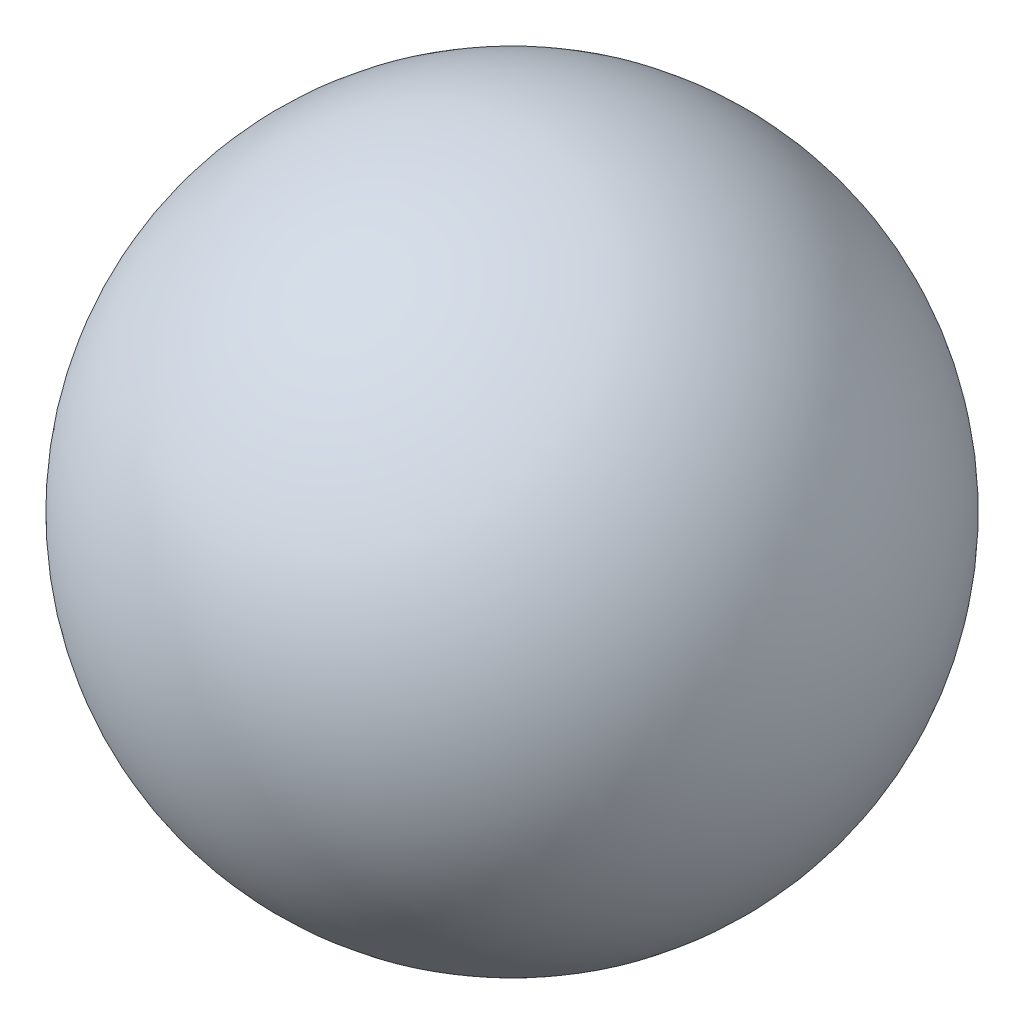
ISO-10303-21;
HEADER;
FILE_DESCRIPTION(('STEP AP214'),'2;1');
FILE_NAME('part.step','',(''),(''),'','','');
FILE_SCHEMA(('AUTOMOTIVE_DESIGN { 1 0 10303 214 1 1 1 1 }'));
ENDSEC;
DATA;
#1=APPLICATION_CONTEXT('core data for automotive mechanical design processes');
#2=APPLICATION_PROTOCOL_DEFINITION('international standard','automotive_design',2000,#1);
#3=PRODUCT_CONTEXT('',#1,'mechanical');
#4=PRODUCT('Part','Part','',(#3));
#5=PRODUCT_RELATED_PRODUCT_CATEGORY('part','',(#4));
#6=PRODUCT_DEFINITION_FORMATION('','',#4);
#7=PRODUCT_DEFINITION_CONTEXT('part definition',#1,'design');
#8=PRODUCT_DEFINITION('design','',#6,#7);
#9=PRODUCT_DEFINITION_SHAPE('','',#8);
#10=(LENGTH_UNIT() NAMED_UNIT(*) SI_UNIT(.MILLI.,.METRE.));
#11=(NAMED_UNIT(*) PLANE_ANGLE_UNIT() SI_UNIT($,.RADIAN.));
#12=(NAMED_UNIT(*) SI_UNIT($,.STERADIAN.) SOLID_ANGLE_UNIT());
#13=UNCERTAINTY_MEASURE_WITH_UNIT(LENGTH_MEASURE(1.E-05),#10,'distance_accuracy_value','');
#14=(GEOMETRIC_REPRESENTATION_CONTEXT(3) GLOBAL_UNCERTAINTY_ASSIGNED_CONTEXT((#13)) GLOBAL_UNIT_ASSIGNED_CONTEXT((#10,
#11,#12)) REPRESENTATION_CONTEXT('',''));
#15=CARTESIAN_POINT('',(0.,0.,0.));
#16=DIRECTION('',(0.,0.,1.));
#17=DIRECTION('',(1.,0.,0.));
#18=AXIS2_PLACEMENT_3D('',#15,#16,#17);
#19=CARTESIAN_POINT('',(0.,0.,0.));
#20=DIRECTION('',(0.,1.,0.));
#21=DIRECTION('',(1.,0.,0.));
#22=AXIS2_PLACEMENT_3D('',#19,#20,#21);
#23=SPHERICAL_SURFACE('',#22,20.);
#24=CARTESIAN_POINT('',(0.,20.,0.));
#25=VERTEX_POINT('',#24);
#26=VERTEX_LOOP('',#25);
#27=FACE_BOUND('',#26,.T.);
#28=ADVANCED_FACE('F46',(#27),#23,.T.);
#29=CLOSED_SHELL('',(#28));
#30=CARTESIAN_POINT('',(0.,0.,0.));
#31=DIRECTION('',(0.,1.,0.));
#32=DIRECTION('',(-1.,0.,0.));
#33=AXIS2_PLACEMENT_3D('',#30,#31,#32);
#34=SPHERICAL_SURFACE('',#33,19.);
#35=CARTESIAN_POINT('',(0.,19.,0.));
#36=VERTEX_POINT('',#35);
#37=VERTEX_LOOP('',#36);
#38=FACE_BOUND('',#37,.T.);
#39=ADVANCED_FACE('F66',(#38),#34,.F.);
#40=CLOSED_SHELL('',(#39));
#41=ORIENTED_CLOSED_SHELL('',*,#40,.T.);
#42=BREP_WITH_VOIDS('B2',#29,(#41));
#43=ADVANCED_BREP_SHAPE_REPRESENTATION('',(#18,#42),#14);
#44=SHAPE_DEFINITION_REPRESENTATION(#9,#43);
ENDSEC;
END-ISO-10303-21;
